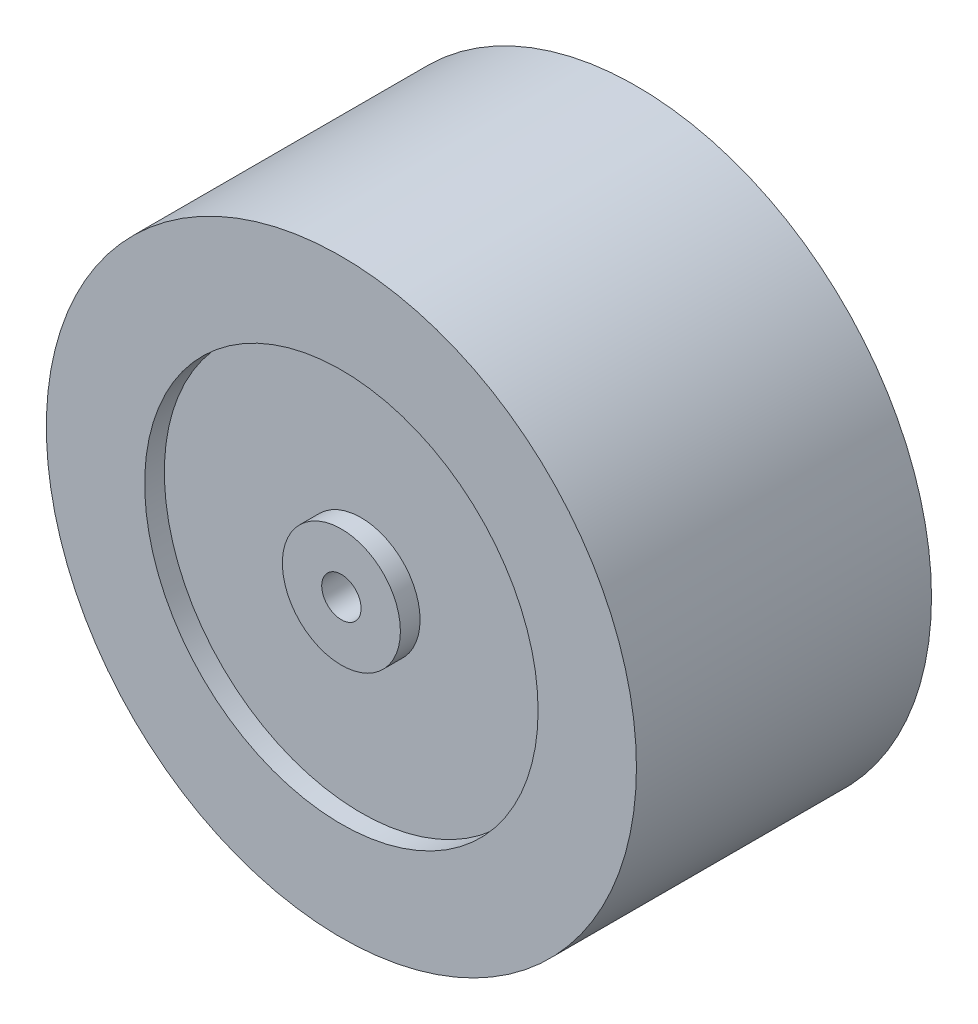
ISO-10303-21;
HEADER;
FILE_DESCRIPTION(('STEP AP214'),'2;1');
FILE_NAME('part.step','',(''),(''),'','','');
FILE_SCHEMA(('AUTOMOTIVE_DESIGN { 1 0 10303 214 1 1 1 1 }'));
ENDSEC;
DATA;
#1=APPLICATION_CONTEXT('core data for automotive mechanical design processes');
#2=APPLICATION_PROTOCOL_DEFINITION('international standard','automotive_design',2000,#1);
#3=PRODUCT_CONTEXT('',#1,'mechanical');
#4=PRODUCT('Part','Part','',(#3));
#5=PRODUCT_RELATED_PRODUCT_CATEGORY('part','',(#4));
#6=PRODUCT_DEFINITION_FORMATION('','',#4);
#7=PRODUCT_DEFINITION_CONTEXT('part definition',#1,'design');
#8=PRODUCT_DEFINITION('design','',#6,#7);
#9=PRODUCT_DEFINITION_SHAPE('','',#8);
#10=(LENGTH_UNIT() NAMED_UNIT(*) SI_UNIT(.MILLI.,.METRE.));
#11=(NAMED_UNIT(*) PLANE_ANGLE_UNIT() SI_UNIT($,.RADIAN.));
#12=(NAMED_UNIT(*) SI_UNIT($,.STERADIAN.) SOLID_ANGLE_UNIT());
#13=UNCERTAINTY_MEASURE_WITH_UNIT(LENGTH_MEASURE(1.E-05),#10,'distance_accuracy_value','');
#14=(GEOMETRIC_REPRESENTATION_CONTEXT(3) GLOBAL_UNCERTAINTY_ASSIGNED_CONTEXT((#13)) GLOBAL_UNIT_ASSIGNED_CONTEXT((#10,
#11,#12)) REPRESENTATION_CONTEXT('',''));
#15=CARTESIAN_POINT('',(0.,0.,0.));
#16=DIRECTION('',(0.,0.,1.));
#17=DIRECTION('',(1.,0.,0.));
#18=AXIS2_PLACEMENT_3D('',#15,#16,#17);
#19=CARTESIAN_POINT('',(0.,0.,300.));
#20=DIRECTION('',(0.,0.,1.));
#21=DIRECTION('',(1.,0.,0.));
#22=AXIS2_PLACEMENT_3D('',#19,#20,#21);
#23=PLANE('',#22);
#24=CARTESIAN_POINT('',(0.,0.,300.));
#25=DIRECTION('',(0.,0.,1.));
#26=DIRECTION('',(1.,0.,0.));
#27=AXIS2_PLACEMENT_3D('',#24,#25,#26);
#28=CIRCLE('',#27,20.);
#29=CARTESIAN_POINT('',(20.,0.,300.));
#30=VERTEX_POINT('',#29);
#31=EDGE_CURVE('E59',#30,#30,#28,.T.);
#32=ORIENTED_EDGE('',*,*,#31,.F.);
#33=EDGE_LOOP('',(#32));
#34=FACE_BOUND('',#33,.T.);
#35=CARTESIAN_POINT('',(0.,0.,300.));
#36=DIRECTION('',(0.,0.,1.));
#37=DIRECTION('',(1.,0.,0.));
#38=AXIS2_PLACEMENT_3D('',#35,#36,#37);
#39=CIRCLE('',#38,60.);
#40=CARTESIAN_POINT('',(60.,0.,300.));
#41=VERTEX_POINT('',#40);
#42=EDGE_CURVE('E71',#41,#41,#39,.T.);
#43=ORIENTED_EDGE('',*,*,#42,.T.);
#44=EDGE_LOOP('',(#43));
#45=FACE_BOUND('',#44,.T.);
#46=ADVANCED_FACE('F46',(#34,#45),#23,.T.);
#47=CARTESIAN_POINT('',(0.,0.,300.));
#48=DIRECTION('',(0.,0.,-1.));
#49=DIRECTION('',(-1.,0.,0.));
#50=AXIS2_PLACEMENT_3D('',#47,#48,#49);
#51=CYLINDRICAL_SURFACE('',#50,300.);
#52=CARTESIAN_POINT('',(0.,0.,300.));
#53=DIRECTION('',(0.,0.,1.));
#54=DIRECTION('',(1.,0.,0.));
#55=AXIS2_PLACEMENT_3D('',#52,#53,#54);
#56=CIRCLE('',#55,300.);
#57=CARTESIAN_POINT('',(300.,0.,300.));
#58=VERTEX_POINT('',#57);
#59=EDGE_CURVE('E12',#58,#58,#56,.T.);
#60=ORIENTED_EDGE('',*,*,#59,.F.);
#61=EDGE_LOOP('',(#60));
#62=FACE_BOUND('',#61,.T.);
#63=CARTESIAN_POINT('',(0.,0.,0.));
#64=DIRECTION('',(0.,0.,1.));
#65=DIRECTION('',(1.,0.,0.));
#66=AXIS2_PLACEMENT_3D('',#63,#64,#65);
#67=CIRCLE('',#66,300.);
#68=CARTESIAN_POINT('',(300.,0.,0.));
#69=VERTEX_POINT('',#68);
#70=EDGE_CURVE('E50',#69,#69,#67,.T.);
#71=ORIENTED_EDGE('',*,*,#70,.T.);
#72=EDGE_LOOP('',(#71));
#73=FACE_BOUND('',#72,.T.);
#74=ADVANCED_FACE('F48',(#62,#73),#51,.T.);
#75=CARTESIAN_POINT('',(0.,0.,300.));
#76=DIRECTION('',(0.,0.,1.));
#77=DIRECTION('',(1.,0.,0.));
#78=AXIS2_PLACEMENT_3D('',#75,#76,#77);
#79=CIRCLE('',#78,200.);
#80=CARTESIAN_POINT('',(200.,0.,300.));
#81=VERTEX_POINT('',#80);
#82=EDGE_CURVE('E65',#81,#81,#79,.T.);
#83=ORIENTED_EDGE('',*,*,#82,.F.);
#84=EDGE_LOOP('',(#83));
#85=FACE_BOUND('',#84,.T.);
#86=ORIENTED_EDGE('',*,*,#59,.T.);
#87=EDGE_LOOP('',(#86));
#88=FACE_BOUND('',#87,.T.);
#89=ADVANCED_FACE('F93',(#85,#88),#23,.T.);
#90=CARTESIAN_POINT('',(0.,0.,0.));
#91=DIRECTION('',(0.,0.,1.));
#92=DIRECTION('',(1.,0.,0.));
#93=AXIS2_PLACEMENT_3D('',#90,#91,#92);
#94=PLANE('',#93);
#95=CARTESIAN_POINT('',(0.,0.,0.));
#96=DIRECTION('',(0.,0.,1.));
#97=DIRECTION('',(1.,0.,0.));
#98=AXIS2_PLACEMENT_3D('',#95,#96,#97);
#99=CIRCLE('',#98,20.);
#100=CARTESIAN_POINT('',(20.,0.,0.));
#101=VERTEX_POINT('',#100);
#102=EDGE_CURVE('E57',#101,#101,#99,.T.);
#103=ORIENTED_EDGE('',*,*,#102,.T.);
#104=EDGE_LOOP('',(#103));
#105=FACE_BOUND('',#104,.T.);
#106=ORIENTED_EDGE('',*,*,#70,.F.);
#107=EDGE_LOOP('',(#106));
#108=FACE_BOUND('',#107,.T.);
#109=ADVANCED_FACE('F95',(#105,#108),#94,.F.);
#110=CARTESIAN_POINT('',(0.,0.,0.));
#111=DIRECTION('',(0.,0.,1.));
#112=DIRECTION('',(1.,0.,0.));
#113=AXIS2_PLACEMENT_3D('',#110,#111,#112);
#114=CYLINDRICAL_SURFACE('',#113,20.);
#115=ORIENTED_EDGE('',*,*,#102,.F.);
#116=EDGE_LOOP('',(#115));
#117=FACE_BOUND('',#116,.T.);
#118=ORIENTED_EDGE('',*,*,#31,.T.);
#119=EDGE_LOOP('',(#118));
#120=FACE_BOUND('',#119,.T.);
#121=ADVANCED_FACE('F89',(#117,#120),#114,.F.);
#122=CARTESIAN_POINT('',(0.,0.,280.));
#123=DIRECTION('',(0.,0.,1.));
#124=DIRECTION('',(1.,0.,0.));
#125=AXIS2_PLACEMENT_3D('',#122,#123,#124);
#126=CYLINDRICAL_SURFACE('',#125,200.);
#127=CARTESIAN_POINT('',(0.,0.,280.));
#128=DIRECTION('',(0.,0.,1.));
#129=DIRECTION('',(1.,0.,0.));
#130=AXIS2_PLACEMENT_3D('',#127,#128,#129);
#131=CIRCLE('',#130,200.);
#132=CARTESIAN_POINT('',(200.,0.,280.));
#133=VERTEX_POINT('',#132);
#134=EDGE_CURVE('E62',#133,#133,#131,.T.);
#135=ORIENTED_EDGE('',*,*,#134,.F.);
#136=EDGE_LOOP('',(#135));
#137=FACE_BOUND('',#136,.T.);
#138=ORIENTED_EDGE('',*,*,#82,.T.);
#139=EDGE_LOOP('',(#138));
#140=FACE_BOUND('',#139,.T.);
#141=ADVANCED_FACE('F83',(#137,#140),#126,.F.);
#142=CARTESIAN_POINT('',(0.,0.,280.));
#143=DIRECTION('',(0.,0.,1.));
#144=DIRECTION('',(1.,0.,0.));
#145=AXIS2_PLACEMENT_3D('',#142,#143,#144);
#146=PLANE('',#145);
#147=CARTESIAN_POINT('',(0.,0.,280.));
#148=DIRECTION('',(0.,0.,1.));
#149=DIRECTION('',(1.,0.,0.));
#150=AXIS2_PLACEMENT_3D('',#147,#148,#149);
#151=CIRCLE('',#150,60.);
#152=CARTESIAN_POINT('',(60.,0.,280.));
#153=VERTEX_POINT('',#152);
#154=EDGE_CURVE('E68',#153,#153,#151,.T.);
#155=ORIENTED_EDGE('',*,*,#154,.F.);
#156=EDGE_LOOP('',(#155));
#157=FACE_BOUND('',#156,.T.);
#158=ORIENTED_EDGE('',*,*,#134,.T.);
#159=EDGE_LOOP('',(#158));
#160=FACE_BOUND('',#159,.T.);
#161=ADVANCED_FACE('F80',(#157,#160),#146,.T.);
#162=CARTESIAN_POINT('',(0.,0.,280.));
#163=DIRECTION('',(0.,0.,1.));
#164=DIRECTION('',(1.,0.,0.));
#165=AXIS2_PLACEMENT_3D('',#162,#163,#164);
#166=CYLINDRICAL_SURFACE('',#165,60.);
#167=ORIENTED_EDGE('',*,*,#154,.T.);
#168=EDGE_LOOP('',(#167));
#169=FACE_BOUND('',#168,.T.);
#170=ORIENTED_EDGE('',*,*,#42,.F.);
#171=EDGE_LOOP('',(#170));
#172=FACE_BOUND('',#171,.T.);
#173=ADVANCED_FACE('F77',(#169,#172),#166,.T.);
#174=CLOSED_SHELL('',(#46,#74,#89,#109,#121,#141,#161,#173));
#175=MANIFOLD_SOLID_BREP('B2',#174);
#176=ADVANCED_BREP_SHAPE_REPRESENTATION('',(#18,#175),#14);
#177=SHAPE_DEFINITION_REPRESENTATION(#9,#176);
ENDSEC;
END-ISO-10303-21;
